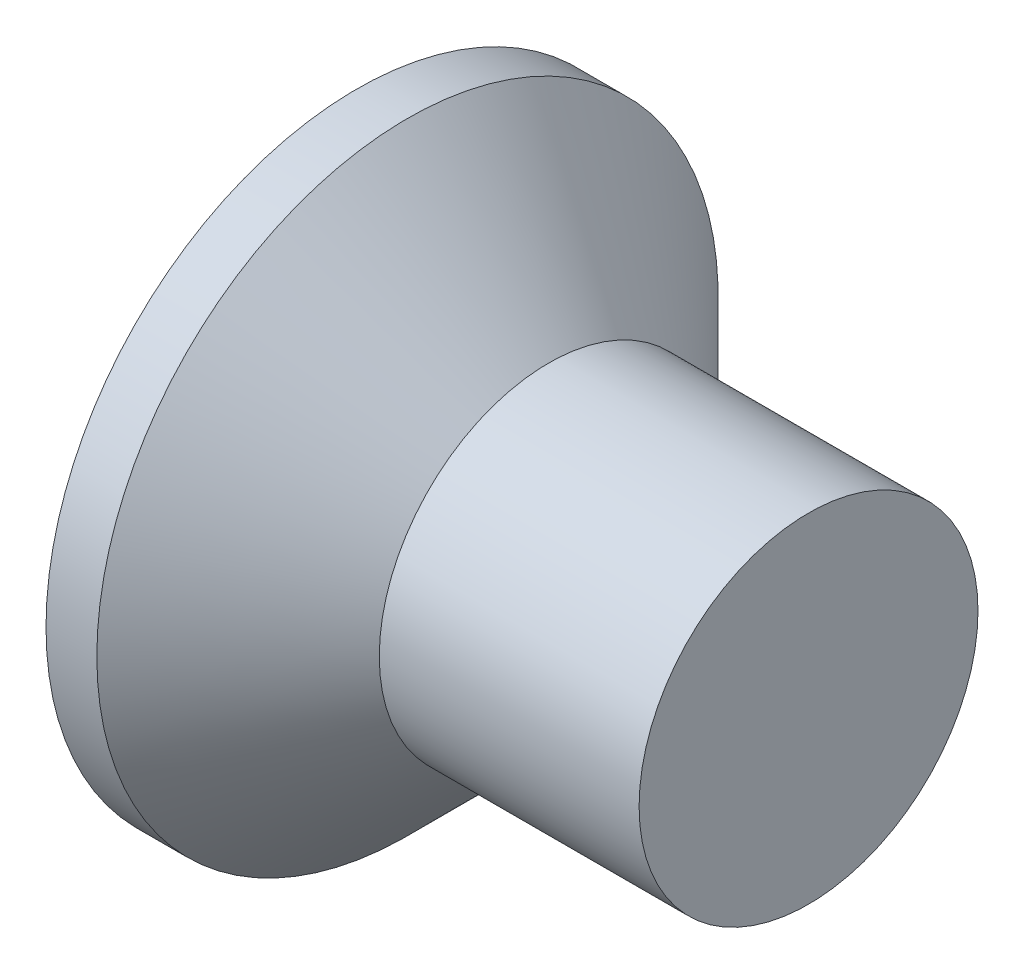
ISO-10303-21;
HEADER;
FILE_DESCRIPTION(('STEP AP214'),'2;1');
FILE_NAME('part.step','',(''),(''),'','','');
FILE_SCHEMA(('AUTOMOTIVE_DESIGN { 1 0 10303 214 1 1 1 1 }'));
ENDSEC;
DATA;
#1=APPLICATION_CONTEXT('core data for automotive mechanical design processes');
#2=APPLICATION_PROTOCOL_DEFINITION('international standard','automotive_design',2000,#1);
#3=PRODUCT_CONTEXT('',#1,'mechanical');
#4=PRODUCT('Part','Part','',(#3));
#5=PRODUCT_RELATED_PRODUCT_CATEGORY('part','',(#4));
#6=PRODUCT_DEFINITION_FORMATION('','',#4);
#7=PRODUCT_DEFINITION_CONTEXT('part definition',#1,'design');
#8=PRODUCT_DEFINITION('design','',#6,#7);
#9=PRODUCT_DEFINITION_SHAPE('','',#8);
#10=(LENGTH_UNIT() NAMED_UNIT(*) SI_UNIT(.MILLI.,.METRE.));
#11=(NAMED_UNIT(*) PLANE_ANGLE_UNIT() SI_UNIT($,.RADIAN.));
#12=(NAMED_UNIT(*) SI_UNIT($,.STERADIAN.) SOLID_ANGLE_UNIT());
#13=UNCERTAINTY_MEASURE_WITH_UNIT(LENGTH_MEASURE(1.E-05),#10,'distance_accuracy_value','');
#14=(GEOMETRIC_REPRESENTATION_CONTEXT(3) GLOBAL_UNCERTAINTY_ASSIGNED_CONTEXT((#13)) GLOBAL_UNIT_ASSIGNED_CONTEXT((#10,
#11,#12)) REPRESENTATION_CONTEXT('',''));
#15=CARTESIAN_POINT('',(0.,0.,0.));
#16=DIRECTION('',(0.,0.,1.));
#17=DIRECTION('',(1.,0.,0.));
#18=AXIS2_PLACEMENT_3D('',#15,#16,#17);
#19=CARTESIAN_POINT('',(0.,0.,0.));
#20=DIRECTION('',(-1.,0.,0.));
#21=DIRECTION('',(0.,0.,1.));
#22=AXIS2_PLACEMENT_3D('',#19,#20,#21);
#23=PLANE('',#22);
#24=CARTESIAN_POINT('',(0.,0.,0.));
#25=DIRECTION('',(-1.,0.,0.));
#26=DIRECTION('',(0.,0.,1.));
#27=AXIS2_PLACEMENT_3D('',#24,#25,#26);
#28=CIRCLE('',#27,2.75);
#29=CARTESIAN_POINT('',(0.,0.,2.75));
#30=VERTEX_POINT('',#29);
#31=EDGE_CURVE('E127',#30,#30,#28,.T.);
#32=ORIENTED_EDGE('',*,*,#31,.T.);
#33=EDGE_LOOP('',(#32));
#34=FACE_BOUND('',#33,.T.);
#35=DIRECTION('',(0.,1.,0.));
#36=VECTOR('',#35,1.);
#37=CARTESIAN_POINT('',(0.,-1.55,-0.395));
#38=LINE('',#37,#36);
#39=CARTESIAN_POINT('',(0.,-1.55,-0.395));
#40=VERTEX_POINT('',#39);
#41=CARTESIAN_POINT('',(0.,-0.394999999999999,-0.395));
#42=VERTEX_POINT('',#41);
#43=EDGE_CURVE('E102',#40,#42,#38,.T.);
#44=ORIENTED_EDGE('',*,*,#43,.T.);
#45=DIRECTION('',(0.,0.,-1.));
#46=VECTOR('',#45,1.);
#47=CARTESIAN_POINT('',(0.,-0.395000000000005,1.55));
#48=LINE('',#47,#46);
#49=CARTESIAN_POINT('',(0.,-0.394999999999995,-1.55));
#50=VERTEX_POINT('',#49);
#51=EDGE_CURVE('E82',#42,#50,#48,.T.);
#52=ORIENTED_EDGE('',*,*,#51,.T.);
#53=DIRECTION('',(0.,1.,0.));
#54=VECTOR('',#53,1.);
#55=CARTESIAN_POINT('',(0.,-0.394999999999995,-1.55));
#56=LINE('',#55,#54);
#57=CARTESIAN_POINT('',(0.,0.395000000000005,-1.55));
#58=VERTEX_POINT('',#57);
#59=EDGE_CURVE('E325',#50,#58,#56,.T.);
#60=ORIENTED_EDGE('',*,*,#59,.T.);
#61=DIRECTION('',(0.,0.,1.));
#62=VECTOR('',#61,1.);
#63=CARTESIAN_POINT('',(0.,0.395000000000005,-1.55));
#64=LINE('',#63,#62);
#65=CARTESIAN_POINT('',(0.,0.395000000000001,-0.395));
#66=VERTEX_POINT('',#65);
#67=EDGE_CURVE('E98',#58,#66,#64,.T.);
#68=ORIENTED_EDGE('',*,*,#67,.T.);
#69=CARTESIAN_POINT('',(0.,1.55,-0.395));
#70=VERTEX_POINT('',#69);
#71=EDGE_CURVE('E92',#66,#70,#38,.T.);
#72=ORIENTED_EDGE('',*,*,#71,.T.);
#73=DIRECTION('',(0.,0.,1.));
#74=VECTOR('',#73,1.);
#75=CARTESIAN_POINT('',(0.,1.55,-0.395));
#76=LINE('',#75,#74);
#77=CARTESIAN_POINT('',(0.,1.55,0.395));
#78=VERTEX_POINT('',#77);
#79=EDGE_CURVE('E95',#70,#78,#76,.T.);
#80=ORIENTED_EDGE('',*,*,#79,.T.);
#81=DIRECTION('',(0.,-1.,0.));
#82=VECTOR('',#81,1.);
#83=CARTESIAN_POINT('',(0.,1.55,0.395));
#84=LINE('',#83,#82);
#85=CARTESIAN_POINT('',(0.,0.394999999999998,0.395));
#86=VERTEX_POINT('',#85);
#87=EDGE_CURVE('E317',#78,#86,#84,.T.);
#88=ORIENTED_EDGE('',*,*,#87,.T.);
#89=CARTESIAN_POINT('',(0.,0.394999999999994,1.55));
#90=VERTEX_POINT('',#89);
#91=EDGE_CURVE('E335',#86,#90,#64,.T.);
#92=ORIENTED_EDGE('',*,*,#91,.T.);
#93=DIRECTION('',(0.,-1.,0.));
#94=VECTOR('',#93,1.);
#95=CARTESIAN_POINT('',(0.,0.394999999999994,1.55));
#96=LINE('',#95,#94);
#97=CARTESIAN_POINT('',(0.,-0.395000000000005,1.55));
#98=VERTEX_POINT('',#97);
#99=EDGE_CURVE('E337',#90,#98,#96,.T.);
#100=ORIENTED_EDGE('',*,*,#99,.T.);
#101=CARTESIAN_POINT('',(0.,-0.395000000000001,0.395));
#102=VERTEX_POINT('',#101);
#103=EDGE_CURVE('E339',#98,#102,#48,.T.);
#104=ORIENTED_EDGE('',*,*,#103,.T.);
#105=CARTESIAN_POINT('',(0.,-1.55,0.395));
#106=VERTEX_POINT('',#105);
#107=EDGE_CURVE('E108',#102,#106,#84,.T.);
#108=ORIENTED_EDGE('',*,*,#107,.T.);
#109=DIRECTION('',(0.,0.,-1.));
#110=VECTOR('',#109,1.);
#111=CARTESIAN_POINT('',(0.,-1.55,0.395));
#112=LINE('',#111,#110);
#113=EDGE_CURVE('E131',#106,#40,#112,.T.);
#114=ORIENTED_EDGE('',*,*,#113,.T.);
#115=EDGE_LOOP('',(#44,#52,#60,#68,#72,#80,#88,#92,#100,#104,#108,#114));
#116=FACE_BOUND('',#115,.T.);
#117=ADVANCED_FACE('F33',(#34,#116),#23,.T.);
#118=CARTESIAN_POINT('',(2.38373382624769,0.,0.16865988909427));
#119=DIRECTION('',(-0.0945267588569114,0.,-0.995522321125954));
#120=DIRECTION('',(-0.995522321125954,0.,0.0945267588569114));
#121=AXIS2_PLACEMENT_3D('',#118,#119,#120);
#122=PLANE('',#121);
#123=ORIENTED_EDGE('',*,*,#107,.F.);
#124=DIRECTION('',(0.991104257398676,0.0941072552097303,-0.09410725520973));
#125=VECTOR('',#124,1.);
#126=CARTESIAN_POINT('',(2.39946475118715,-0.16716620751949,0.167166207519489));
#127=LINE('',#126,#125);
#128=CARTESIAN_POINT('',(2.08,-0.197500000000001,0.197499999999999));
#129=VERTEX_POINT('',#128);
#130=EDGE_CURVE('E126',#102,#129,#127,.T.);
#131=ORIENTED_EDGE('',*,*,#130,.T.);
#132=DIRECTION('',(0.835707904588478,0.543411029305728,-0.0793520726712617));
#133=VECTOR('',#132,1.);
#134=CARTESIAN_POINT('',(0.,-1.55,0.395));
#135=LINE('',#134,#133);
#136=EDGE_CURVE('E103',#106,#129,#135,.T.);
#137=ORIENTED_EDGE('',*,*,#136,.F.);
#138=EDGE_LOOP('',(#123,#131,#137));
#139=FACE_BOUND('',#138,.T.);
#140=ADVANCED_FACE('F151',(#139),#122,.T.);
#141=DIRECTION('',(0.835707904588477,-0.543411029305729,-0.0793520726712615));
#142=VECTOR('',#141,1.);
#143=CARTESIAN_POINT('',(0.,1.55,0.395));
#144=LINE('',#143,#142);
#145=CARTESIAN_POINT('',(2.08,0.1975,0.1975));
#146=VERTEX_POINT('',#145);
#147=EDGE_CURVE('E48',#78,#146,#144,.T.);
#148=ORIENTED_EDGE('',*,*,#147,.T.);
#149=DIRECTION('',(-0.991104257398676,0.0941072552097295,0.0941072552097299));
#150=VECTOR('',#149,1.);
#151=CARTESIAN_POINT('',(2.39946475118715,0.167166207519489,0.167166207519489));
#152=LINE('',#151,#150);
#153=EDGE_CURVE('E321',#146,#86,#152,.T.);
#154=ORIENTED_EDGE('',*,*,#153,.T.);
#155=ORIENTED_EDGE('',*,*,#87,.F.);
#156=EDGE_LOOP('',(#148,#154,#155));
#157=FACE_BOUND('',#156,.T.);
#158=ADVANCED_FACE('F157',(#157),#122,.T.);
#159=CARTESIAN_POINT('',(2.38373382624769,0.,-0.16865988909427));
#160=DIRECTION('',(-0.0945267588569113,0.,0.995522321125954));
#161=DIRECTION('',(0.995522321125954,0.,0.0945267588569113));
#162=AXIS2_PLACEMENT_3D('',#159,#160,#161);
#163=PLANE('',#162);
#164=DIRECTION('',(0.835707904588478,0.543411029305728,0.0793520726712615));
#165=VECTOR('',#164,1.);
#166=CARTESIAN_POINT('',(0.,-1.55,-0.395));
#167=LINE('',#166,#165);
#168=CARTESIAN_POINT('',(2.08,-0.197499999999999,-0.197500000000001));
#169=VERTEX_POINT('',#168);
#170=EDGE_CURVE('E57',#40,#169,#167,.T.);
#171=ORIENTED_EDGE('',*,*,#170,.T.);
#172=DIRECTION('',(-0.991104257398676,-0.0941072552097296,-0.0941072552097298));
#173=VECTOR('',#172,1.);
#174=CARTESIAN_POINT('',(2.39946475118715,-0.167166207519489,-0.167166207519489));
#175=LINE('',#174,#173);
#176=EDGE_CURVE('E11',#169,#42,#175,.T.);
#177=ORIENTED_EDGE('',*,*,#176,.T.);
#178=ORIENTED_EDGE('',*,*,#43,.F.);
#179=EDGE_LOOP('',(#171,#177,#178));
#180=FACE_BOUND('',#179,.T.);
#181=ADVANCED_FACE('F148',(#180),#163,.T.);
#182=ORIENTED_EDGE('',*,*,#71,.F.);
#183=DIRECTION('',(0.991104257398676,-0.0941072552097302,0.0941072552097298));
#184=VECTOR('',#183,1.);
#185=CARTESIAN_POINT('',(2.39946475118715,0.16716620751949,-0.167166207519489));
#186=LINE('',#185,#184);
#187=CARTESIAN_POINT('',(2.08,0.1975,-0.1975));
#188=VERTEX_POINT('',#187);
#189=EDGE_CURVE('E111',#66,#188,#186,.T.);
#190=ORIENTED_EDGE('',*,*,#189,.T.);
#191=DIRECTION('',(0.835707904588477,-0.543411029305729,0.0793520726712615));
#192=VECTOR('',#191,1.);
#193=CARTESIAN_POINT('',(0.,1.55,-0.395));
#194=LINE('',#193,#192);
#195=EDGE_CURVE('E107',#70,#188,#194,.T.);
#196=ORIENTED_EDGE('',*,*,#195,.F.);
#197=EDGE_LOOP('',(#182,#190,#196));
#198=FACE_BOUND('',#197,.T.);
#199=ADVANCED_FACE('F110',(#198),#163,.T.);
#200=CARTESIAN_POINT('',(4.,1.5,0.));
#201=DIRECTION('',(1.,0.,0.));
#202=DIRECTION('',(0.,0.,-1.));
#203=AXIS2_PLACEMENT_3D('',#200,#201,#202);
#204=PLANE('',#203);
#205=CARTESIAN_POINT('',(4.,0.,0.));
#206=DIRECTION('',(-1.,0.,0.));
#207=DIRECTION('',(0.,0.,1.));
#208=AXIS2_PLACEMENT_3D('',#205,#206,#207);
#209=CIRCLE('',#208,1.5);
#210=CARTESIAN_POINT('',(4.,0.,1.5));
#211=VERTEX_POINT('',#210);
#212=EDGE_CURVE('E41',#211,#211,#209,.T.);
#213=ORIENTED_EDGE('',*,*,#212,.F.);
#214=EDGE_LOOP('',(#213));
#215=FACE_BOUND('',#214,.T.);
#216=ADVANCED_FACE('F35',(#215),#204,.T.);
#217=CARTESIAN_POINT('',(-6.34999999999999,0.,0.));
#218=DIRECTION('',(-1.,0.,0.));
#219=DIRECTION('',(0.,0.,1.));
#220=AXIS2_PLACEMENT_3D('',#217,#218,#219);
#221=CYLINDRICAL_SURFACE('',#220,1.5);
#222=ORIENTED_EDGE('',*,*,#212,.T.);
#223=EDGE_LOOP('',(#222));
#224=FACE_BOUND('',#223,.T.);
#225=CARTESIAN_POINT('',(1.7,0.,0.));
#226=DIRECTION('',(-1.,0.,0.));
#227=DIRECTION('',(0.,0.,1.));
#228=AXIS2_PLACEMENT_3D('',#225,#226,#227);
#229=CIRCLE('',#228,1.5);
#230=CARTESIAN_POINT('',(1.7,0.,1.5));
#231=VERTEX_POINT('',#230);
#232=EDGE_CURVE('E134',#231,#231,#229,.T.);
#233=ORIENTED_EDGE('',*,*,#232,.F.);
#234=EDGE_LOOP('',(#233));
#235=FACE_BOUND('',#234,.T.);
#236=ADVANCED_FACE('F139',(#224,#235),#221,.T.);
#237=CARTESIAN_POINT('',(0.450000000000004,0.,0.));
#238=DIRECTION('',(-1.,0.,0.));
#239=DIRECTION('',(0.,0.,1.));
#240=AXIS2_PLACEMENT_3D('',#237,#238,#239);
#241=CONICAL_SURFACE('',#240,2.75,0.78539816339745);
#242=ORIENTED_EDGE('',*,*,#232,.T.);
#243=EDGE_LOOP('',(#242));
#244=FACE_BOUND('',#243,.T.);
#245=CARTESIAN_POINT('',(0.450000000000004,0.,0.));
#246=DIRECTION('',(-1.,0.,0.));
#247=DIRECTION('',(0.,0.,1.));
#248=AXIS2_PLACEMENT_3D('',#245,#246,#247);
#249=CIRCLE('',#248,2.75);
#250=CARTESIAN_POINT('',(0.450000000000004,0.,2.75));
#251=VERTEX_POINT('',#250);
#252=EDGE_CURVE('E130',#251,#251,#249,.T.);
#253=ORIENTED_EDGE('',*,*,#252,.F.);
#254=EDGE_LOOP('',(#253));
#255=FACE_BOUND('',#254,.T.);
#256=ADVANCED_FACE('F147',(#244,#255),#241,.T.);
#257=CARTESIAN_POINT('',(-6.34999999999999,0.,0.));
#258=DIRECTION('',(-1.,0.,0.));
#259=DIRECTION('',(0.,0.,1.));
#260=AXIS2_PLACEMENT_3D('',#257,#258,#259);
#261=CYLINDRICAL_SURFACE('',#260,2.75);
#262=ORIENTED_EDGE('',*,*,#252,.T.);
#263=EDGE_LOOP('',(#262));
#264=FACE_BOUND('',#263,.T.);
#265=ORIENTED_EDGE('',*,*,#31,.F.);
#266=EDGE_LOOP('',(#265));
#267=FACE_BOUND('',#266,.T.);
#268=ADVANCED_FACE('F164',(#264,#267),#261,.T.);
#269=CARTESIAN_POINT('',(2.08,0.1975,-0.1975));
#270=DIRECTION('',(1.,0.,0.));
#271=DIRECTION('',(0.,0.,-1.));
#272=AXIS2_PLACEMENT_3D('',#269,#270,#271);
#273=PLANE('',#272);
#274=DIRECTION('',(0.,1.,0.));
#275=VECTOR('',#274,1.);
#276=CARTESIAN_POINT('',(2.08,-0.1975,-0.1975));
#277=LINE('',#276,#275);
#278=EDGE_CURVE('E122',#169,#188,#277,.T.);
#279=ORIENTED_EDGE('',*,*,#278,.F.);
#280=DIRECTION('',(0.,0.,-1.));
#281=VECTOR('',#280,1.);
#282=CARTESIAN_POINT('',(2.08,-0.1975,0.1975));
#283=LINE('',#282,#281);
#284=EDGE_CURVE('E113',#129,#169,#283,.T.);
#285=ORIENTED_EDGE('',*,*,#284,.F.);
#286=DIRECTION('',(0.,-1.,0.));
#287=VECTOR('',#286,1.);
#288=CARTESIAN_POINT('',(2.08,0.1975,0.1975));
#289=LINE('',#288,#287);
#290=EDGE_CURVE('E116',#146,#129,#289,.T.);
#291=ORIENTED_EDGE('',*,*,#290,.F.);
#292=DIRECTION('',(0.,0.,1.));
#293=VECTOR('',#292,1.);
#294=CARTESIAN_POINT('',(2.08,0.1975,-0.1975));
#295=LINE('',#294,#293);
#296=EDGE_CURVE('E120',#188,#146,#295,.T.);
#297=ORIENTED_EDGE('',*,*,#296,.F.);
#298=EDGE_LOOP('',(#279,#285,#291,#297));
#299=FACE_BOUND('',#298,.T.);
#300=ADVANCED_FACE('F162',(#299),#273,.F.);
#301=CARTESIAN_POINT('',(0.,-1.55,-0.395));
#302=DIRECTION('',(-0.54513001368185,0.838351518268576,0.));
#303=DIRECTION('',(-0.838351518268576,-0.54513001368185,0.));
#304=AXIS2_PLACEMENT_3D('',#301,#302,#303);
#305=PLANE('',#304);
#306=ORIENTED_EDGE('',*,*,#170,.F.);
#307=ORIENTED_EDGE('',*,*,#113,.F.);
#308=ORIENTED_EDGE('',*,*,#136,.T.);
#309=ORIENTED_EDGE('',*,*,#284,.T.);
#310=EDGE_LOOP('',(#306,#307,#308,#309));
#311=FACE_BOUND('',#310,.T.);
#312=ADVANCED_FACE('F189',(#311),#305,.T.);
#313=CARTESIAN_POINT('',(2.08,0.1975,0.1975));
#314=DIRECTION('',(-0.54513001368185,-0.838351518268575,0.));
#315=DIRECTION('',(0.838351518268576,-0.54513001368185,0.));
#316=AXIS2_PLACEMENT_3D('',#313,#314,#315);
#317=PLANE('',#316);
#318=ORIENTED_EDGE('',*,*,#147,.F.);
#319=ORIENTED_EDGE('',*,*,#79,.F.);
#320=ORIENTED_EDGE('',*,*,#195,.T.);
#321=ORIENTED_EDGE('',*,*,#296,.T.);
#322=EDGE_LOOP('',(#318,#319,#320,#321));
#323=FACE_BOUND('',#322,.T.);
#324=ADVANCED_FACE('F106',(#323),#317,.T.);
#325=CARTESIAN_POINT('',(2.38373382624769,-0.16865988909427,0.));
#326=DIRECTION('',(-0.0945267588569114,0.995522321125954,0.));
#327=DIRECTION('',(-0.995522321125954,-0.0945267588569114,0.));
#328=AXIS2_PLACEMENT_3D('',#325,#326,#327);
#329=PLANE('',#328);
#330=DIRECTION('',(0.835707904588478,0.0793520726712598,0.543411029305728));
#331=VECTOR('',#330,1.);
#332=CARTESIAN_POINT('',(0.,-0.394999999999995,-1.55));
#333=LINE('',#332,#331);
#334=EDGE_CURVE('E332',#50,#169,#333,.T.);
#335=ORIENTED_EDGE('',*,*,#334,.F.);
#336=ORIENTED_EDGE('',*,*,#51,.F.);
#337=ORIENTED_EDGE('',*,*,#176,.F.);
#338=EDGE_LOOP('',(#335,#336,#337));
#339=FACE_BOUND('',#338,.T.);
#340=ADVANCED_FACE('F198',(#339),#329,.T.);
#341=CARTESIAN_POINT('',(2.38373382624769,0.16865988909427,0.));
#342=DIRECTION('',(-0.0945267588569113,-0.995522321125954,0.));
#343=DIRECTION('',(0.995522321125954,-0.0945267588569113,0.));
#344=AXIS2_PLACEMENT_3D('',#341,#342,#343);
#345=PLANE('',#344);
#346=ORIENTED_EDGE('',*,*,#67,.F.);
#347=DIRECTION('',(0.835707904588478,-0.0793520726712634,0.543411029305728));
#348=VECTOR('',#347,1.);
#349=CARTESIAN_POINT('',(0.,0.395000000000005,-1.55));
#350=LINE('',#349,#348);
#351=EDGE_CURVE('E73',#58,#188,#350,.T.);
#352=ORIENTED_EDGE('',*,*,#351,.T.);
#353=ORIENTED_EDGE('',*,*,#189,.F.);
#354=EDGE_LOOP('',(#346,#352,#353));
#355=FACE_BOUND('',#354,.T.);
#356=ADVANCED_FACE('F209',(#355),#345,.T.);
#357=CARTESIAN_POINT('',(0.,0.395000000000005,-1.55));
#358=DIRECTION('',(-0.54513001368185,0.,0.838351518268576));
#359=DIRECTION('',(-0.838351518268576,0.,-0.54513001368185));
#360=AXIS2_PLACEMENT_3D('',#357,#358,#359);
#361=PLANE('',#360);
#362=ORIENTED_EDGE('',*,*,#351,.F.);
#363=ORIENTED_EDGE('',*,*,#59,.F.);
#364=ORIENTED_EDGE('',*,*,#334,.T.);
#365=ORIENTED_EDGE('',*,*,#278,.T.);
#366=EDGE_LOOP('',(#362,#363,#364,#365));
#367=FACE_BOUND('',#366,.T.);
#368=ADVANCED_FACE('F217',(#367),#361,.T.);
#369=ORIENTED_EDGE('',*,*,#103,.F.);
#370=DIRECTION('',(0.835707904588477,0.0793520726712634,-0.543411029305728));
#371=VECTOR('',#370,1.);
#372=CARTESIAN_POINT('',(0.,-0.395000000000005,1.55));
#373=LINE('',#372,#371);
#374=EDGE_CURVE('E328',#98,#129,#373,.T.);
#375=ORIENTED_EDGE('',*,*,#374,.T.);
#376=ORIENTED_EDGE('',*,*,#130,.F.);
#377=EDGE_LOOP('',(#369,#375,#376));
#378=FACE_BOUND('',#377,.T.);
#379=ADVANCED_FACE('F211',(#378),#329,.T.);
#380=DIRECTION('',(0.835707904588477,-0.0793520726712596,-0.543411029305729));
#381=VECTOR('',#380,1.);
#382=CARTESIAN_POINT('',(0.,0.394999999999994,1.55));
#383=LINE('',#382,#381);
#384=EDGE_CURVE('E326',#90,#146,#383,.T.);
#385=ORIENTED_EDGE('',*,*,#384,.F.);
#386=ORIENTED_EDGE('',*,*,#91,.F.);
#387=ORIENTED_EDGE('',*,*,#153,.F.);
#388=EDGE_LOOP('',(#385,#386,#387));
#389=FACE_BOUND('',#388,.T.);
#390=ADVANCED_FACE('F219',(#389),#345,.T.);
#391=CARTESIAN_POINT('',(2.08,-0.197500000000001,0.197499999999999));
#392=DIRECTION('',(-0.54513001368185,0.,-0.838351518268575));
#393=DIRECTION('',(0.838351518268576,0.,-0.54513001368185));
#394=AXIS2_PLACEMENT_3D('',#391,#392,#393);
#395=PLANE('',#394);
#396=ORIENTED_EDGE('',*,*,#374,.F.);
#397=ORIENTED_EDGE('',*,*,#99,.F.);
#398=ORIENTED_EDGE('',*,*,#384,.T.);
#399=ORIENTED_EDGE('',*,*,#290,.T.);
#400=EDGE_LOOP('',(#396,#397,#398,#399));
#401=FACE_BOUND('',#400,.T.);
#402=ADVANCED_FACE('F238',(#401),#395,.T.);
#403=CLOSED_SHELL('',(#117,#140,#158,#181,#199,#216,#236,#256,#268,#300,#312,#324,#340,#356,
#368,#379,#390,#402));
#404=MANIFOLD_SOLID_BREP('B2',#403);
#405=ADVANCED_BREP_SHAPE_REPRESENTATION('',(#18,#404),#14);
#406=SHAPE_DEFINITION_REPRESENTATION(#9,#405);
ENDSEC;
END-ISO-10303-21;
